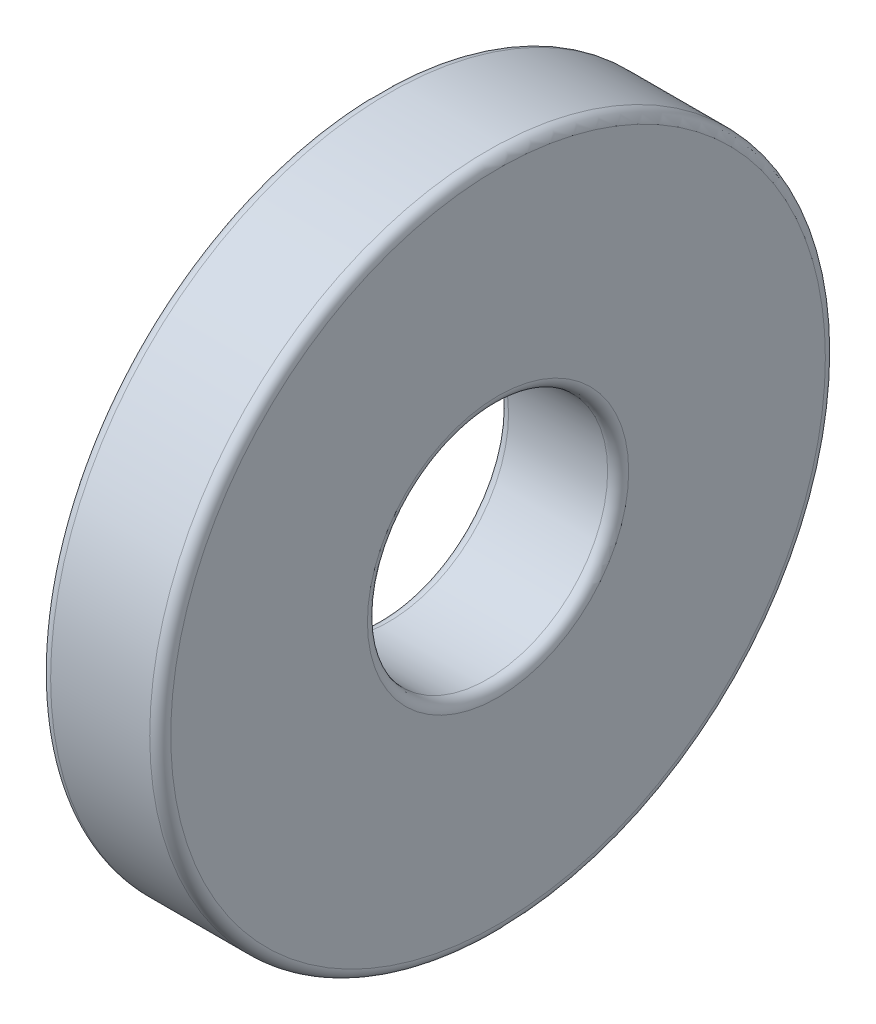
ISO-10303-21;
HEADER;
FILE_DESCRIPTION(('STEP AP214'),'2;1');
FILE_NAME('part.step','',(''),(''),'','','');
FILE_SCHEMA(('AUTOMOTIVE_DESIGN { 1 0 10303 214 1 1 1 1 }'));
ENDSEC;
DATA;
#1=APPLICATION_CONTEXT('core data for automotive mechanical design processes');
#2=APPLICATION_PROTOCOL_DEFINITION('international standard','automotive_design',2000,#1);
#3=PRODUCT_CONTEXT('',#1,'mechanical');
#4=PRODUCT('Part','Part','',(#3));
#5=PRODUCT_RELATED_PRODUCT_CATEGORY('part','',(#4));
#6=PRODUCT_DEFINITION_FORMATION('','',#4);
#7=PRODUCT_DEFINITION_CONTEXT('part definition',#1,'design');
#8=PRODUCT_DEFINITION('design','',#6,#7);
#9=PRODUCT_DEFINITION_SHAPE('','',#8);
#10=(LENGTH_UNIT() NAMED_UNIT(*) SI_UNIT(.MILLI.,.METRE.));
#11=(NAMED_UNIT(*) PLANE_ANGLE_UNIT() SI_UNIT($,.RADIAN.));
#12=(NAMED_UNIT(*) SI_UNIT($,.STERADIAN.) SOLID_ANGLE_UNIT());
#13=UNCERTAINTY_MEASURE_WITH_UNIT(LENGTH_MEASURE(1.E-05),#10,'distance_accuracy_value','');
#14=(GEOMETRIC_REPRESENTATION_CONTEXT(3) GLOBAL_UNCERTAINTY_ASSIGNED_CONTEXT((#13)) GLOBAL_UNIT_ASSIGNED_CONTEXT((#10,
#11,#12)) REPRESENTATION_CONTEXT('',''));
#15=CARTESIAN_POINT('',(0.,0.,0.));
#16=DIRECTION('',(0.,0.,1.));
#17=DIRECTION('',(1.,0.,0.));
#18=AXIS2_PLACEMENT_3D('',#15,#16,#17);
#19=CARTESIAN_POINT('',(4.,0.,0.));
#20=DIRECTION('',(1.,0.,0.));
#21=DIRECTION('',(0.,0.,-1.));
#22=AXIS2_PLACEMENT_3D('',#19,#20,#21);
#23=PLANE('',#22);
#24=CARTESIAN_POINT('',(4.,0.,0.));
#25=DIRECTION('',(1.,0.,0.));
#26=DIRECTION('',(0.,0.,-1.));
#27=AXIS2_PLACEMENT_3D('',#24,#25,#26);
#28=CIRCLE('',#27,4.35);
#29=CARTESIAN_POINT('',(4.,0.,-4.35));
#30=VERTEX_POINT('',#29);
#31=EDGE_CURVE('E10',#30,#30,#28,.F.);
#32=ORIENTED_EDGE('',*,*,#31,.T.);
#33=EDGE_LOOP('',(#32));
#34=FACE_BOUND('',#33,.T.);
#35=CARTESIAN_POINT('',(4.,0.,0.));
#36=DIRECTION('',(1.,0.,0.));
#37=DIRECTION('',(0.,0.,-1.));
#38=AXIS2_PLACEMENT_3D('',#35,#36,#37);
#39=CIRCLE('',#38,10.9);
#40=CARTESIAN_POINT('',(4.,0.,-10.9));
#41=VERTEX_POINT('',#40);
#42=EDGE_CURVE('E38',#41,#41,#39,.T.);
#43=ORIENTED_EDGE('',*,*,#42,.T.);
#44=EDGE_LOOP('',(#43));
#45=FACE_BOUND('',#44,.T.);
#46=ADVANCED_FACE('F31',(#34,#45),#23,.T.);
#47=CARTESIAN_POINT('',(0.,0.,0.));
#48=DIRECTION('',(1.,0.,0.));
#49=DIRECTION('',(0.,0.,-1.));
#50=AXIS2_PLACEMENT_3D('',#47,#48,#49);
#51=PLANE('',#50);
#52=CARTESIAN_POINT('',(0.,0.,0.));
#53=DIRECTION('',(1.,0.,0.));
#54=DIRECTION('',(0.,0.,-1.));
#55=AXIS2_PLACEMENT_3D('',#52,#53,#54);
#56=CIRCLE('',#55,4.35);
#57=CARTESIAN_POINT('',(0.,0.,-4.35));
#58=VERTEX_POINT('',#57);
#59=EDGE_CURVE('E57',#58,#58,#56,.T.);
#60=ORIENTED_EDGE('',*,*,#59,.T.);
#61=EDGE_LOOP('',(#60));
#62=FACE_BOUND('',#61,.T.);
#63=CARTESIAN_POINT('',(0.,0.,0.));
#64=DIRECTION('',(1.,0.,0.));
#65=DIRECTION('',(0.,0.,-1.));
#66=AXIS2_PLACEMENT_3D('',#63,#64,#65);
#67=CIRCLE('',#66,10.9);
#68=CARTESIAN_POINT('',(0.,0.,-10.9));
#69=VERTEX_POINT('',#68);
#70=EDGE_CURVE('E60',#69,#69,#67,.F.);
#71=ORIENTED_EDGE('',*,*,#70,.T.);
#72=EDGE_LOOP('',(#71));
#73=FACE_BOUND('',#72,.T.);
#74=ADVANCED_FACE('F64',(#62,#73),#51,.F.);
#75=CARTESIAN_POINT('',(4.,0.,0.));
#76=DIRECTION('',(-1.,0.,0.));
#77=DIRECTION('',(0.,0.,1.));
#78=AXIS2_PLACEMENT_3D('',#75,#76,#77);
#79=CYLINDRICAL_SURFACE('',#78,11.25);
#80=CARTESIAN_POINT('',(0.35,0.,0.));
#81=DIRECTION('',(1.,0.,0.));
#82=DIRECTION('',(0.,0.,-1.));
#83=AXIS2_PLACEMENT_3D('',#80,#81,#82);
#84=CIRCLE('',#83,11.25);
#85=CARTESIAN_POINT('',(0.35,0.,-11.25));
#86=VERTEX_POINT('',#85);
#87=EDGE_CURVE('E42',#86,#86,#84,.T.);
#88=ORIENTED_EDGE('',*,*,#87,.T.);
#89=EDGE_LOOP('',(#88));
#90=FACE_BOUND('',#89,.T.);
#91=CARTESIAN_POINT('',(3.65,0.,0.));
#92=DIRECTION('',(1.,0.,0.));
#93=DIRECTION('',(0.,0.,-1.));
#94=AXIS2_PLACEMENT_3D('',#91,#92,#93);
#95=CIRCLE('',#94,11.25);
#96=CARTESIAN_POINT('',(3.65,0.,-11.25));
#97=VERTEX_POINT('',#96);
#98=EDGE_CURVE('E46',#97,#97,#95,.F.);
#99=ORIENTED_EDGE('',*,*,#98,.T.);
#100=EDGE_LOOP('',(#99));
#101=FACE_BOUND('',#100,.T.);
#102=ADVANCED_FACE('F74',(#90,#101),#79,.T.);
#103=CARTESIAN_POINT('',(4.,0.,0.));
#104=DIRECTION('',(-1.,0.,0.));
#105=DIRECTION('',(0.,0.,1.));
#106=AXIS2_PLACEMENT_3D('',#103,#104,#105);
#107=CYLINDRICAL_SURFACE('',#106,4.);
#108=CARTESIAN_POINT('',(0.35,0.,0.));
#109=DIRECTION('',(1.,0.,0.));
#110=DIRECTION('',(0.,0.,-1.));
#111=AXIS2_PLACEMENT_3D('',#108,#109,#110);
#112=CIRCLE('',#111,4.);
#113=CARTESIAN_POINT('',(0.35,0.,-4.));
#114=VERTEX_POINT('',#113);
#115=EDGE_CURVE('E51',#114,#114,#112,.F.);
#116=ORIENTED_EDGE('',*,*,#115,.T.);
#117=EDGE_LOOP('',(#116));
#118=FACE_BOUND('',#117,.T.);
#119=CARTESIAN_POINT('',(3.65,0.,0.));
#120=DIRECTION('',(1.,0.,0.));
#121=DIRECTION('',(0.,0.,-1.));
#122=AXIS2_PLACEMENT_3D('',#119,#120,#121);
#123=CIRCLE('',#122,4.);
#124=CARTESIAN_POINT('',(3.65,0.,-4.));
#125=VERTEX_POINT('',#124);
#126=EDGE_CURVE('E54',#125,#125,#123,.T.);
#127=ORIENTED_EDGE('',*,*,#126,.T.);
#128=EDGE_LOOP('',(#127));
#129=FACE_BOUND('',#128,.T.);
#130=ADVANCED_FACE('F77',(#118,#129),#107,.F.);
#131=CARTESIAN_POINT('',(0.35,0.,0.));
#132=DIRECTION('',(1.,0.,0.));
#133=DIRECTION('',(0.,0.,-1.));
#134=AXIS2_PLACEMENT_3D('',#131,#132,#133);
#135=TOROIDAL_SURFACE('',#134,4.35,0.35);
#136=ORIENTED_EDGE('',*,*,#115,.F.);
#137=EDGE_LOOP('',(#136));
#138=FACE_BOUND('',#137,.T.);
#139=ORIENTED_EDGE('',*,*,#59,.F.);
#140=EDGE_LOOP('',(#139));
#141=FACE_BOUND('',#140,.T.);
#142=ADVANCED_FACE('F70',(#138,#141),#135,.T.);
#143=CARTESIAN_POINT('',(0.35,0.,0.));
#144=DIRECTION('',(1.,0.,0.));
#145=DIRECTION('',(0.,0.,-1.));
#146=AXIS2_PLACEMENT_3D('',#143,#144,#145);
#147=TOROIDAL_SURFACE('',#146,10.9,0.35);
#148=ORIENTED_EDGE('',*,*,#70,.F.);
#149=EDGE_LOOP('',(#148));
#150=FACE_BOUND('',#149,.T.);
#151=ORIENTED_EDGE('',*,*,#87,.F.);
#152=EDGE_LOOP('',(#151));
#153=FACE_BOUND('',#152,.T.);
#154=ADVANCED_FACE('F66',(#150,#153),#147,.T.);
#155=CARTESIAN_POINT('',(3.65,0.,0.));
#156=DIRECTION('',(1.,0.,0.));
#157=DIRECTION('',(0.,0.,-1.));
#158=AXIS2_PLACEMENT_3D('',#155,#156,#157);
#159=TOROIDAL_SURFACE('',#158,4.35,0.35);
#160=ORIENTED_EDGE('',*,*,#31,.F.);
#161=EDGE_LOOP('',(#160));
#162=FACE_BOUND('',#161,.T.);
#163=ORIENTED_EDGE('',*,*,#126,.F.);
#164=EDGE_LOOP('',(#163));
#165=FACE_BOUND('',#164,.T.);
#166=ADVANCED_FACE('F69',(#162,#165),#159,.T.);
#167=CARTESIAN_POINT('',(3.65,0.,0.));
#168=DIRECTION('',(1.,0.,0.));
#169=DIRECTION('',(0.,0.,-1.));
#170=AXIS2_PLACEMENT_3D('',#167,#168,#169);
#171=TOROIDAL_SURFACE('',#170,10.9,0.35);
#172=ORIENTED_EDGE('',*,*,#98,.F.);
#173=EDGE_LOOP('',(#172));
#174=FACE_BOUND('',#173,.T.);
#175=ORIENTED_EDGE('',*,*,#42,.F.);
#176=EDGE_LOOP('',(#175));
#177=FACE_BOUND('',#176,.T.);
#178=ADVANCED_FACE('F33',(#174,#177),#171,.T.);
#179=CLOSED_SHELL('',(#46,#74,#102,#130,#142,#154,#166,#178));
#180=MANIFOLD_SOLID_BREP('B2',#179);
#181=ADVANCED_BREP_SHAPE_REPRESENTATION('',(#18,#180),#14);
#182=SHAPE_DEFINITION_REPRESENTATION(#9,#181);
ENDSEC;
END-ISO-10303-21;
